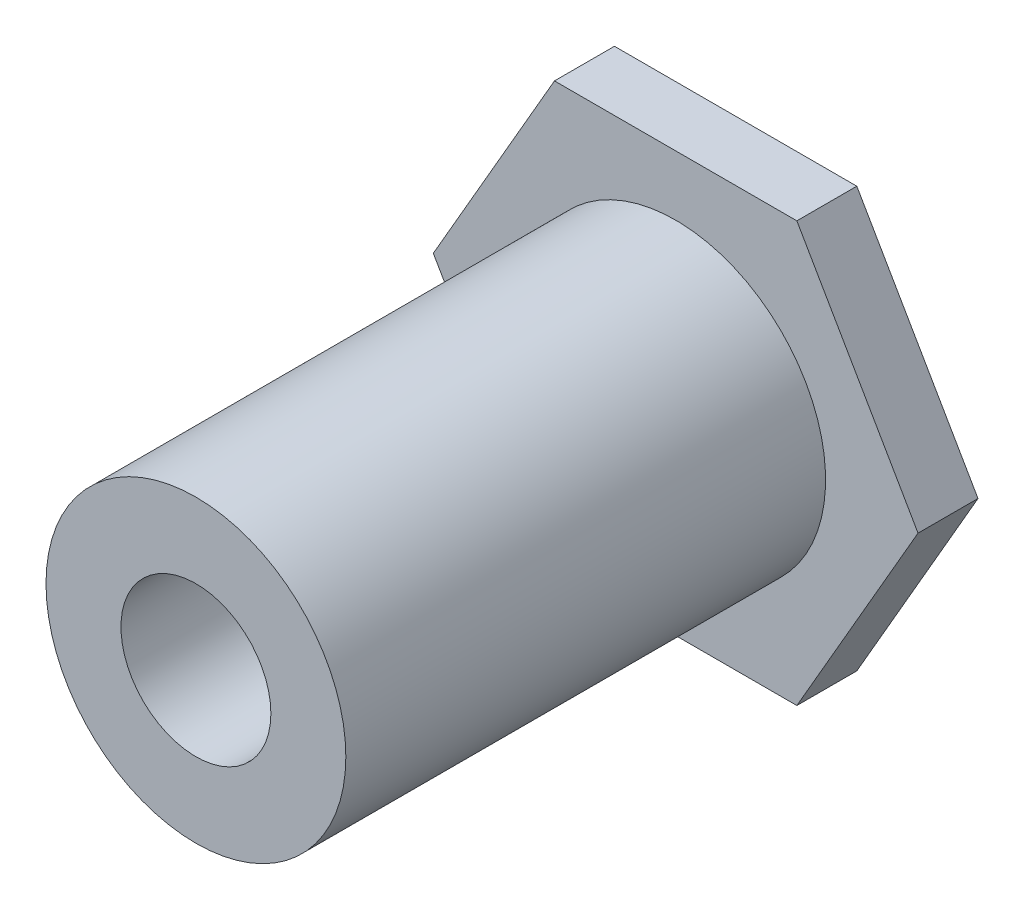
ISO-10303-21;
HEADER;
FILE_DESCRIPTION(('STEP AP214'),'2;1');
FILE_NAME('part.step','',(''),(''),'','','');
FILE_SCHEMA(('AUTOMOTIVE_DESIGN { 1 0 10303 214 1 1 1 1 }'));
ENDSEC;
DATA;
#1=APPLICATION_CONTEXT('core data for automotive mechanical design processes');
#2=APPLICATION_PROTOCOL_DEFINITION('international standard','automotive_design',2000,#1);
#3=PRODUCT_CONTEXT('',#1,'mechanical');
#4=PRODUCT('Part','Part','',(#3));
#5=PRODUCT_RELATED_PRODUCT_CATEGORY('part','',(#4));
#6=PRODUCT_DEFINITION_FORMATION('','',#4);
#7=PRODUCT_DEFINITION_CONTEXT('part definition',#1,'design');
#8=PRODUCT_DEFINITION('design','',#6,#7);
#9=PRODUCT_DEFINITION_SHAPE('','',#8);
#10=(LENGTH_UNIT() NAMED_UNIT(*) SI_UNIT(.MILLI.,.METRE.));
#11=(NAMED_UNIT(*) PLANE_ANGLE_UNIT() SI_UNIT($,.RADIAN.));
#12=(NAMED_UNIT(*) SI_UNIT($,.STERADIAN.) SOLID_ANGLE_UNIT());
#13=UNCERTAINTY_MEASURE_WITH_UNIT(LENGTH_MEASURE(1.E-05),#10,'distance_accuracy_value','');
#14=(GEOMETRIC_REPRESENTATION_CONTEXT(3) GLOBAL_UNCERTAINTY_ASSIGNED_CONTEXT((#13)) GLOBAL_UNIT_ASSIGNED_CONTEXT((#10,
#11,#12)) REPRESENTATION_CONTEXT('',''));
#15=CARTESIAN_POINT('',(0.,0.,0.));
#16=DIRECTION('',(0.,0.,1.));
#17=DIRECTION('',(1.,0.,0.));
#18=AXIS2_PLACEMENT_3D('',#15,#16,#17);
#19=CARTESIAN_POINT('',(0.,0.,8.));
#20=DIRECTION('',(0.,0.,1.));
#21=DIRECTION('',(1.,0.,0.));
#22=AXIS2_PLACEMENT_3D('',#19,#20,#21);
#23=PLANE('',#22);
#24=CARTESIAN_POINT('',(0.,0.,8.));
#25=DIRECTION('',(0.,0.,1.));
#26=DIRECTION('',(1.,0.,0.));
#27=AXIS2_PLACEMENT_3D('',#24,#25,#26);
#28=CIRCLE('',#27,2.5);
#29=CARTESIAN_POINT('',(2.5,0.,8.));
#30=VERTEX_POINT('',#29);
#31=EDGE_CURVE('E11',#30,#30,#28,.T.);
#32=ORIENTED_EDGE('',*,*,#31,.T.);
#33=EDGE_LOOP('',(#32));
#34=FACE_BOUND('',#33,.T.);
#35=CARTESIAN_POINT('',(0.,0.,8.));
#36=DIRECTION('',(0.,0.,1.));
#37=DIRECTION('',(1.,0.,0.));
#38=AXIS2_PLACEMENT_3D('',#35,#36,#37);
#39=CIRCLE('',#38,1.25);
#40=CARTESIAN_POINT('',(1.25,0.,8.));
#41=VERTEX_POINT('',#40);
#42=EDGE_CURVE('E42',#41,#41,#39,.T.);
#43=ORIENTED_EDGE('',*,*,#42,.F.);
#44=EDGE_LOOP('',(#43));
#45=FACE_BOUND('',#44,.T.);
#46=ADVANCED_FACE('F33',(#34,#45),#23,.T.);
#47=CARTESIAN_POINT('',(0.,0.,8.));
#48=DIRECTION('',(0.,0.,-1.));
#49=DIRECTION('',(-1.,0.,0.));
#50=AXIS2_PLACEMENT_3D('',#47,#48,#49);
#51=CYLINDRICAL_SURFACE('',#50,2.5);
#52=ORIENTED_EDGE('',*,*,#31,.F.);
#53=EDGE_LOOP('',(#52));
#54=FACE_BOUND('',#53,.T.);
#55=CARTESIAN_POINT('',(0.,0.,0.));
#56=DIRECTION('',(0.,0.,-1.));
#57=DIRECTION('',(-1.,0.,0.));
#58=AXIS2_PLACEMENT_3D('',#55,#56,#57);
#59=CIRCLE('',#58,2.5);
#60=CARTESIAN_POINT('',(-2.5,0.,0.));
#61=VERTEX_POINT('',#60);
#62=EDGE_CURVE('E138',#61,#61,#59,.T.);
#63=ORIENTED_EDGE('',*,*,#62,.F.);
#64=EDGE_LOOP('',(#63));
#65=FACE_BOUND('',#64,.T.);
#66=ADVANCED_FACE('F35',(#54,#65),#51,.T.);
#67=CARTESIAN_POINT('',(0.,0.,8.));
#68=DIRECTION('',(0.,0.,-1.));
#69=DIRECTION('',(-1.,0.,0.));
#70=AXIS2_PLACEMENT_3D('',#67,#68,#69);
#71=CYLINDRICAL_SURFACE('',#70,1.25);
#72=ORIENTED_EDGE('',*,*,#42,.T.);
#73=EDGE_LOOP('',(#72));
#74=FACE_BOUND('',#73,.T.);
#75=CARTESIAN_POINT('',(0.,0.,0.));
#76=DIRECTION('',(0.,0.,1.));
#77=DIRECTION('',(1.,0.,0.));
#78=AXIS2_PLACEMENT_3D('',#75,#76,#77);
#79=CIRCLE('',#78,1.25);
#80=CARTESIAN_POINT('',(1.25,0.,0.));
#81=VERTEX_POINT('',#80);
#82=EDGE_CURVE('E141',#81,#81,#79,.T.);
#83=ORIENTED_EDGE('',*,*,#82,.F.);
#84=EDGE_LOOP('',(#83));
#85=FACE_BOUND('',#84,.T.);
#86=ADVANCED_FACE('F148',(#74,#85),#71,.F.);
#87=CARTESIAN_POINT('',(0.,0.,0.));
#88=DIRECTION('',(0.,0.,-1.));
#89=DIRECTION('',(-1.,0.,0.));
#90=AXIS2_PLACEMENT_3D('',#87,#88,#89);
#91=PLANE('',#90);
#92=ORIENTED_EDGE('',*,*,#82,.T.);
#93=EDGE_LOOP('',(#92));
#94=FACE_BOUND('',#93,.T.);
#95=ADVANCED_FACE('F146',(#94),#91,.F.);
#96=CARTESIAN_POINT('',(4.04145188432738,0.,-1.));
#97=DIRECTION('',(-0.866025403784438,0.5,0.));
#98=DIRECTION('',(-0.5,-0.866025403784439,0.));
#99=AXIS2_PLACEMENT_3D('',#96,#97,#98);
#100=PLANE('',#99);
#101=DIRECTION('',(-0.5,-0.866025403784438,0.));
#102=VECTOR('',#101,1.);
#103=CARTESIAN_POINT('',(4.04145188432738,0.,0.));
#104=LINE('',#103,#102);
#105=CARTESIAN_POINT('',(4.04145188432738,0.,0.));
#106=VERTEX_POINT('',#105);
#107=CARTESIAN_POINT('',(2.02072594216369,-3.5,0.));
#108=VERTEX_POINT('',#107);
#109=EDGE_CURVE('E119',#106,#108,#104,.T.);
#110=ORIENTED_EDGE('',*,*,#109,.T.);
#111=DIRECTION('',(0.,0.,1.));
#112=VECTOR('',#111,1.);
#113=CARTESIAN_POINT('',(2.02072594216369,-3.5,-1.));
#114=LINE('',#113,#112);
#115=CARTESIAN_POINT('',(2.02072594216369,-3.5,-1.));
#116=VERTEX_POINT('',#115);
#117=EDGE_CURVE('E136',#116,#108,#114,.T.);
#118=ORIENTED_EDGE('',*,*,#117,.F.);
#119=DIRECTION('',(-0.5,-0.866025403784438,0.));
#120=VECTOR('',#119,1.);
#121=CARTESIAN_POINT('',(4.04145188432738,0.,-1.));
#122=LINE('',#121,#120);
#123=CARTESIAN_POINT('',(4.04145188432738,0.,-1.));
#124=VERTEX_POINT('',#123);
#125=EDGE_CURVE('E129',#124,#116,#122,.T.);
#126=ORIENTED_EDGE('',*,*,#125,.F.);
#127=DIRECTION('',(0.,0.,1.));
#128=VECTOR('',#127,1.);
#129=CARTESIAN_POINT('',(4.04145188432738,0.,-1.));
#130=LINE('',#129,#128);
#131=EDGE_CURVE('E115',#124,#106,#130,.T.);
#132=ORIENTED_EDGE('',*,*,#131,.T.);
#133=EDGE_LOOP('',(#110,#118,#126,#132));
#134=FACE_BOUND('',#133,.T.);
#135=ADVANCED_FACE('F156',(#134),#100,.F.);
#136=CARTESIAN_POINT('',(2.02072594216369,-3.5,-1.));
#137=DIRECTION('',(0.,1.,0.));
#138=DIRECTION('',(-1.,0.,0.));
#139=AXIS2_PLACEMENT_3D('',#136,#137,#138);
#140=PLANE('',#139);
#141=DIRECTION('',(-1.,0.,0.));
#142=VECTOR('',#141,1.);
#143=CARTESIAN_POINT('',(2.02072594216369,-3.5,0.));
#144=LINE('',#143,#142);
#145=CARTESIAN_POINT('',(-2.02072594216369,-3.5,0.));
#146=VERTEX_POINT('',#145);
#147=EDGE_CURVE('E122',#108,#146,#144,.T.);
#148=ORIENTED_EDGE('',*,*,#147,.T.);
#149=DIRECTION('',(0.,0.,1.));
#150=VECTOR('',#149,1.);
#151=CARTESIAN_POINT('',(-2.02072594216369,-3.5,-1.));
#152=LINE('',#151,#150);
#153=CARTESIAN_POINT('',(-2.02072594216369,-3.5,-1.));
#154=VERTEX_POINT('',#153);
#155=EDGE_CURVE('E133',#154,#146,#152,.T.);
#156=ORIENTED_EDGE('',*,*,#155,.F.);
#157=DIRECTION('',(-1.,0.,0.));
#158=VECTOR('',#157,1.);
#159=CARTESIAN_POINT('',(2.02072594216369,-3.5,-1.));
#160=LINE('',#159,#158);
#161=EDGE_CURVE('E88',#116,#154,#160,.T.);
#162=ORIENTED_EDGE('',*,*,#161,.F.);
#163=ORIENTED_EDGE('',*,*,#117,.T.);
#164=EDGE_LOOP('',(#148,#156,#162,#163));
#165=FACE_BOUND('',#164,.T.);
#166=ADVANCED_FACE('F193',(#165),#140,.F.);
#167=CARTESIAN_POINT('',(-2.02072594216369,-3.5,-1.));
#168=DIRECTION('',(0.866025403784439,0.499999999999999,0.));
#169=DIRECTION('',(-0.499999999999999,0.866025403784439,0.));
#170=AXIS2_PLACEMENT_3D('',#167,#168,#169);
#171=PLANE('',#170);
#172=DIRECTION('',(-0.5,0.866025403784439,0.));
#173=VECTOR('',#172,1.);
#174=CARTESIAN_POINT('',(-2.02072594216369,-3.5,0.));
#175=LINE('',#174,#173);
#176=CARTESIAN_POINT('',(-4.04145188432738,0.,0.));
#177=VERTEX_POINT('',#176);
#178=EDGE_CURVE('E124',#146,#177,#175,.T.);
#179=ORIENTED_EDGE('',*,*,#178,.T.);
#180=DIRECTION('',(0.,0.,1.));
#181=VECTOR('',#180,1.);
#182=CARTESIAN_POINT('',(-4.04145188432738,0.,-1.));
#183=LINE('',#182,#181);
#184=CARTESIAN_POINT('',(-4.04145188432738,0.,-1.));
#185=VERTEX_POINT('',#184);
#186=EDGE_CURVE('E110',#185,#177,#183,.T.);
#187=ORIENTED_EDGE('',*,*,#186,.F.);
#188=DIRECTION('',(-0.5,0.866025403784439,0.));
#189=VECTOR('',#188,1.);
#190=CARTESIAN_POINT('',(-2.02072594216369,-3.5,-1.));
#191=LINE('',#190,#189);
#192=EDGE_CURVE('E101',#154,#185,#191,.T.);
#193=ORIENTED_EDGE('',*,*,#192,.F.);
#194=ORIENTED_EDGE('',*,*,#155,.T.);
#195=EDGE_LOOP('',(#179,#187,#193,#194));
#196=FACE_BOUND('',#195,.T.);
#197=ADVANCED_FACE('F190',(#196),#171,.F.);
#198=CARTESIAN_POINT('',(-4.04145188432738,0.,-1.));
#199=DIRECTION('',(0.866025403784438,-0.5,0.));
#200=DIRECTION('',(0.5,0.866025403784439,0.));
#201=AXIS2_PLACEMENT_3D('',#198,#199,#200);
#202=PLANE('',#201);
#203=DIRECTION('',(0.5,0.866025403784438,0.));
#204=VECTOR('',#203,1.);
#205=CARTESIAN_POINT('',(-4.04145188432738,0.,0.));
#206=LINE('',#205,#204);
#207=CARTESIAN_POINT('',(-2.02072594216369,3.5,0.));
#208=VERTEX_POINT('',#207);
#209=EDGE_CURVE('E109',#177,#208,#206,.T.);
#210=ORIENTED_EDGE('',*,*,#209,.T.);
#211=DIRECTION('',(0.,0.,1.));
#212=VECTOR('',#211,1.);
#213=CARTESIAN_POINT('',(-2.02072594216369,3.5,-1.));
#214=LINE('',#213,#212);
#215=CARTESIAN_POINT('',(-2.02072594216369,3.5,-1.));
#216=VERTEX_POINT('',#215);
#217=EDGE_CURVE('E106',#216,#208,#214,.T.);
#218=ORIENTED_EDGE('',*,*,#217,.F.);
#219=DIRECTION('',(0.5,0.866025403784438,0.));
#220=VECTOR('',#219,1.);
#221=CARTESIAN_POINT('',(-4.04145188432738,0.,-1.));
#222=LINE('',#221,#220);
#223=EDGE_CURVE('E95',#185,#216,#222,.T.);
#224=ORIENTED_EDGE('',*,*,#223,.F.);
#225=ORIENTED_EDGE('',*,*,#186,.T.);
#226=EDGE_LOOP('',(#210,#218,#224,#225));
#227=FACE_BOUND('',#226,.T.);
#228=ADVANCED_FACE('F107',(#227),#202,.F.);
#229=CARTESIAN_POINT('',(-2.02072594216369,3.5,-1.));
#230=DIRECTION('',(0.,-1.,0.));
#231=DIRECTION('',(1.,0.,0.));
#232=AXIS2_PLACEMENT_3D('',#229,#230,#231);
#233=PLANE('',#232);
#234=DIRECTION('',(1.,0.,0.));
#235=VECTOR('',#234,1.);
#236=CARTESIAN_POINT('',(-2.02072594216369,3.5,0.));
#237=LINE('',#236,#235);
#238=CARTESIAN_POINT('',(2.02072594216369,3.5,0.));
#239=VERTEX_POINT('',#238);
#240=EDGE_CURVE('E73',#208,#239,#237,.T.);
#241=ORIENTED_EDGE('',*,*,#240,.T.);
#242=DIRECTION('',(0.,0.,1.));
#243=VECTOR('',#242,1.);
#244=CARTESIAN_POINT('',(2.02072594216369,3.5,-1.));
#245=LINE('',#244,#243);
#246=CARTESIAN_POINT('',(2.02072594216369,3.5,-1.));
#247=VERTEX_POINT('',#246);
#248=EDGE_CURVE('E111',#247,#239,#245,.T.);
#249=ORIENTED_EDGE('',*,*,#248,.F.);
#250=DIRECTION('',(1.,0.,0.));
#251=VECTOR('',#250,1.);
#252=CARTESIAN_POINT('',(-2.02072594216369,3.5,-1.));
#253=LINE('',#252,#251);
#254=EDGE_CURVE('E99',#216,#247,#253,.T.);
#255=ORIENTED_EDGE('',*,*,#254,.F.);
#256=ORIENTED_EDGE('',*,*,#217,.T.);
#257=EDGE_LOOP('',(#241,#249,#255,#256));
#258=FACE_BOUND('',#257,.T.);
#259=ADVANCED_FACE('F113',(#258),#233,.F.);
#260=CARTESIAN_POINT('',(2.02072594216369,3.5,-1.));
#261=DIRECTION('',(-0.866025403784439,-0.5,0.));
#262=DIRECTION('',(0.5,-0.866025403784439,0.));
#263=AXIS2_PLACEMENT_3D('',#260,#261,#262);
#264=PLANE('',#263);
#265=DIRECTION('',(0.5,-0.866025403784439,0.));
#266=VECTOR('',#265,1.);
#267=CARTESIAN_POINT('',(2.02072594216369,3.5,0.));
#268=LINE('',#267,#266);
#269=EDGE_CURVE('E79',#239,#106,#268,.T.);
#270=ORIENTED_EDGE('',*,*,#269,.T.);
#271=ORIENTED_EDGE('',*,*,#131,.F.);
#272=DIRECTION('',(0.5,-0.866025403784439,0.));
#273=VECTOR('',#272,1.);
#274=CARTESIAN_POINT('',(2.02072594216369,3.5,-1.));
#275=LINE('',#274,#273);
#276=EDGE_CURVE('E50',#247,#124,#275,.T.);
#277=ORIENTED_EDGE('',*,*,#276,.F.);
#278=ORIENTED_EDGE('',*,*,#248,.T.);
#279=EDGE_LOOP('',(#270,#271,#277,#278));
#280=FACE_BOUND('',#279,.T.);
#281=ADVANCED_FACE('F178',(#280),#264,.F.);
#282=CARTESIAN_POINT('',(0.,0.,-1.));
#283=DIRECTION('',(0.,0.,-1.));
#284=DIRECTION('',(-1.,0.,0.));
#285=AXIS2_PLACEMENT_3D('',#282,#283,#284);
#286=PLANE('',#285);
#287=ORIENTED_EDGE('',*,*,#125,.T.);
#288=ORIENTED_EDGE('',*,*,#161,.T.);
#289=ORIENTED_EDGE('',*,*,#192,.T.);
#290=ORIENTED_EDGE('',*,*,#223,.T.);
#291=ORIENTED_EDGE('',*,*,#254,.T.);
#292=ORIENTED_EDGE('',*,*,#276,.T.);
#293=EDGE_LOOP('',(#287,#288,#289,#290,#291,#292));
#294=FACE_BOUND('',#293,.T.);
#295=ADVANCED_FACE('F97',(#294),#286,.T.);
#296=ORIENTED_EDGE('',*,*,#62,.T.);
#297=EDGE_LOOP('',(#296));
#298=FACE_BOUND('',#297,.T.);
#299=ORIENTED_EDGE('',*,*,#109,.F.);
#300=ORIENTED_EDGE('',*,*,#269,.F.);
#301=ORIENTED_EDGE('',*,*,#240,.F.);
#302=ORIENTED_EDGE('',*,*,#209,.F.);
#303=ORIENTED_EDGE('',*,*,#178,.F.);
#304=ORIENTED_EDGE('',*,*,#147,.F.);
#305=EDGE_LOOP('',(#299,#300,#301,#302,#303,#304));
#306=FACE_BOUND('',#305,.T.);
#307=ADVANCED_FACE('F158',(#298,#306),#91,.F.);
#308=CLOSED_SHELL('',(#46,#66,#86,#95,#135,#166,#197,#228,#259,#281,#295,#307));
#309=MANIFOLD_SOLID_BREP('B2',#308);
#310=ADVANCED_BREP_SHAPE_REPRESENTATION('',(#18,#309),#14);
#311=SHAPE_DEFINITION_REPRESENTATION(#9,#310);
ENDSEC;
END-ISO-10303-21;
